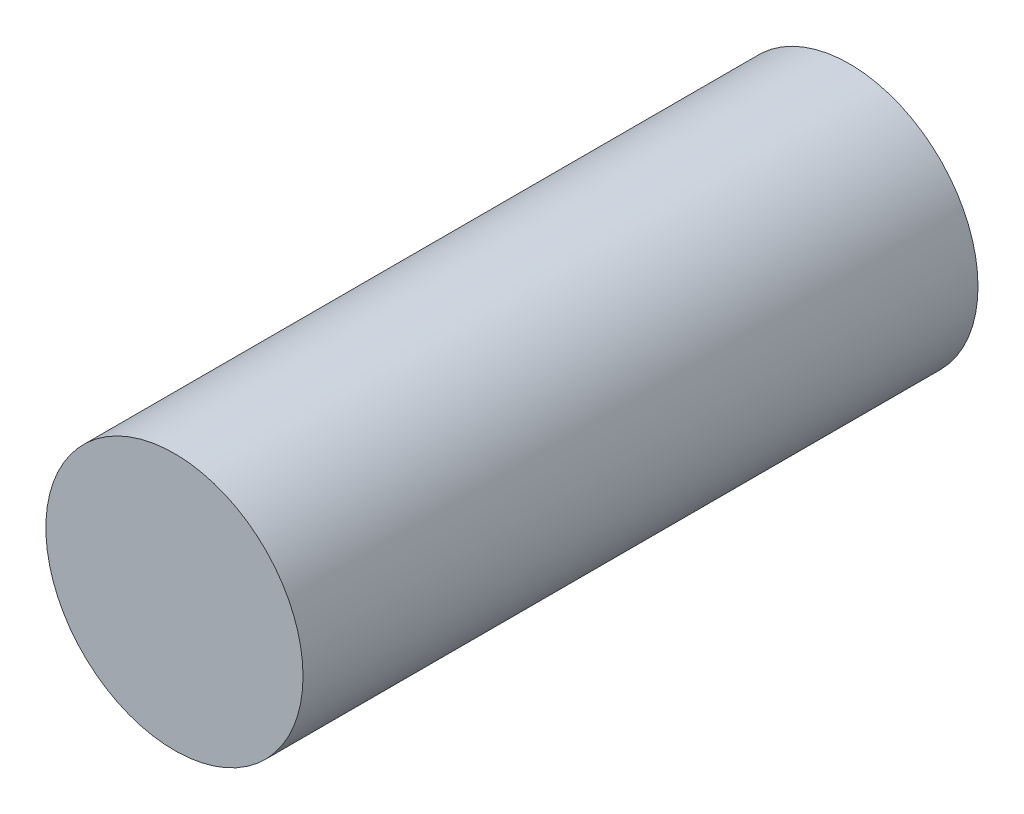
ISO-10303-21;
HEADER;
FILE_DESCRIPTION(('STEP AP214'),'2;1');
FILE_NAME('part.step','',(''),(''),'','','');
FILE_SCHEMA(('AUTOMOTIVE_DESIGN { 1 0 10303 214 1 1 1 1 }'));
ENDSEC;
DATA;
#1=APPLICATION_CONTEXT('core data for automotive mechanical design processes');
#2=APPLICATION_PROTOCOL_DEFINITION('international standard','automotive_design',2000,#1);
#3=PRODUCT_CONTEXT('',#1,'mechanical');
#4=PRODUCT('Part','Part','',(#3));
#5=PRODUCT_RELATED_PRODUCT_CATEGORY('part','',(#4));
#6=PRODUCT_DEFINITION_FORMATION('','',#4);
#7=PRODUCT_DEFINITION_CONTEXT('part definition',#1,'design');
#8=PRODUCT_DEFINITION('design','',#6,#7);
#9=PRODUCT_DEFINITION_SHAPE('','',#8);
#10=(LENGTH_UNIT() NAMED_UNIT(*) SI_UNIT(.MILLI.,.METRE.));
#11=(NAMED_UNIT(*) PLANE_ANGLE_UNIT() SI_UNIT($,.RADIAN.));
#12=(NAMED_UNIT(*) SI_UNIT($,.STERADIAN.) SOLID_ANGLE_UNIT());
#13=UNCERTAINTY_MEASURE_WITH_UNIT(LENGTH_MEASURE(1.E-05),#10,'distance_accuracy_value','');
#14=(GEOMETRIC_REPRESENTATION_CONTEXT(3) GLOBAL_UNCERTAINTY_ASSIGNED_CONTEXT((#13)) GLOBAL_UNIT_ASSIGNED_CONTEXT((#10,
#11,#12)) REPRESENTATION_CONTEXT('',''));
#15=CARTESIAN_POINT('',(0.,0.,0.));
#16=DIRECTION('',(0.,0.,1.));
#17=DIRECTION('',(1.,0.,0.));
#18=AXIS2_PLACEMENT_3D('',#15,#16,#17);
#19=CARTESIAN_POINT('',(0.,0.,50.));
#20=DIRECTION('',(0.,0.,-1.));
#21=DIRECTION('',(-1.,0.,0.));
#22=AXIS2_PLACEMENT_3D('',#19,#20,#21);
#23=CYLINDRICAL_SURFACE('',#22,9.525);
#24=CARTESIAN_POINT('',(0.,0.,50.));
#25=DIRECTION('',(0.,0.,1.));
#26=DIRECTION('',(1.,0.,0.));
#27=AXIS2_PLACEMENT_3D('',#24,#25,#26);
#28=CIRCLE('',#27,9.525);
#29=CARTESIAN_POINT('',(9.525,0.,50.));
#30=VERTEX_POINT('',#29);
#31=EDGE_CURVE('E10',#30,#30,#28,.T.);
#32=ORIENTED_EDGE('',*,*,#31,.F.);
#33=EDGE_LOOP('',(#32));
#34=FACE_BOUND('',#33,.T.);
#35=CARTESIAN_POINT('',(0.,0.,0.));
#36=DIRECTION('',(0.,0.,1.));
#37=DIRECTION('',(1.,0.,0.));
#38=AXIS2_PLACEMENT_3D('',#35,#36,#37);
#39=CIRCLE('',#38,9.525);
#40=CARTESIAN_POINT('',(9.525,0.,0.));
#41=VERTEX_POINT('',#40);
#42=EDGE_CURVE('E34',#41,#41,#39,.T.);
#43=ORIENTED_EDGE('',*,*,#42,.T.);
#44=EDGE_LOOP('',(#43));
#45=FACE_BOUND('',#44,.T.);
#46=ADVANCED_FACE('F31',(#34,#45),#23,.T.);
#47=CARTESIAN_POINT('',(0.,0.,50.));
#48=DIRECTION('',(0.,0.,1.));
#49=DIRECTION('',(1.,0.,0.));
#50=AXIS2_PLACEMENT_3D('',#47,#48,#49);
#51=PLANE('',#50);
#52=ORIENTED_EDGE('',*,*,#31,.T.);
#53=EDGE_LOOP('',(#52));
#54=FACE_BOUND('',#53,.T.);
#55=ADVANCED_FACE('F46',(#54),#51,.T.);
#56=CARTESIAN_POINT('',(0.,0.,0.));
#57=DIRECTION('',(0.,0.,1.));
#58=DIRECTION('',(1.,0.,0.));
#59=AXIS2_PLACEMENT_3D('',#56,#57,#58);
#60=PLANE('',#59);
#61=ORIENTED_EDGE('',*,*,#42,.F.);
#62=EDGE_LOOP('',(#61));
#63=FACE_BOUND('',#62,.T.);
#64=ADVANCED_FACE('F44',(#63),#60,.F.);
#65=CLOSED_SHELL('',(#46,#55,#64));
#66=MANIFOLD_SOLID_BREP('B2',#65);
#67=ADVANCED_BREP_SHAPE_REPRESENTATION('',(#18,#66),#14);
#68=SHAPE_DEFINITION_REPRESENTATION(#9,#67);
ENDSEC;
END-ISO-10303-21;
